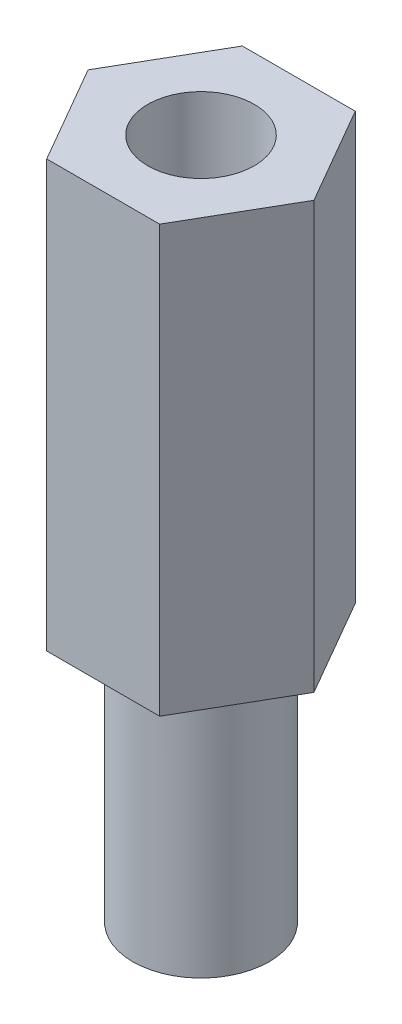
ISO-10303-21;
HEADER;
FILE_DESCRIPTION(('STEP AP214'),'2;1');
FILE_NAME('part.step','',(''),(''),'','','');
FILE_SCHEMA(('AUTOMOTIVE_DESIGN { 1 0 10303 214 1 1 1 1 }'));
ENDSEC;
DATA;
#1=APPLICATION_CONTEXT('core data for automotive mechanical design processes');
#2=APPLICATION_PROTOCOL_DEFINITION('international standard','automotive_design',2000,#1);
#3=PRODUCT_CONTEXT('',#1,'mechanical');
#4=PRODUCT('Part','Part','',(#3));
#5=PRODUCT_RELATED_PRODUCT_CATEGORY('part','',(#4));
#6=PRODUCT_DEFINITION_FORMATION('','',#4);
#7=PRODUCT_DEFINITION_CONTEXT('part definition',#1,'design');
#8=PRODUCT_DEFINITION('design','',#6,#7);
#9=PRODUCT_DEFINITION_SHAPE('','',#8);
#10=(LENGTH_UNIT() NAMED_UNIT(*) SI_UNIT(.MILLI.,.METRE.));
#11=(NAMED_UNIT(*) PLANE_ANGLE_UNIT() SI_UNIT($,.RADIAN.));
#12=(NAMED_UNIT(*) SI_UNIT($,.STERADIAN.) SOLID_ANGLE_UNIT());
#13=UNCERTAINTY_MEASURE_WITH_UNIT(LENGTH_MEASURE(1.E-05),#10,'distance_accuracy_value','');
#14=(GEOMETRIC_REPRESENTATION_CONTEXT(3) GLOBAL_UNCERTAINTY_ASSIGNED_CONTEXT((#13)) GLOBAL_UNIT_ASSIGNED_CONTEXT((#10,
#11,#12)) REPRESENTATION_CONTEXT('',''));
#15=CARTESIAN_POINT('',(0.,0.,0.));
#16=DIRECTION('',(0.,0.,1.));
#17=DIRECTION('',(1.,0.,0.));
#18=AXIS2_PLACEMENT_3D('',#15,#16,#17);
#19=CARTESIAN_POINT('',(-1.325,10.,2.29496732002876));
#20=DIRECTION('',(0.,0.,-1.));
#21=DIRECTION('',(-1.,0.,0.));
#22=AXIS2_PLACEMENT_3D('',#19,#20,#21);
#23=PLANE('',#22);
#24=DIRECTION('',(1.,0.,0.));
#25=VECTOR('',#24,1.);
#26=CARTESIAN_POINT('',(-1.325,0.,2.29496732002876));
#27=LINE('',#26,#25);
#28=CARTESIAN_POINT('',(-1.325,0.,2.29496732002876));
#29=VERTEX_POINT('',#28);
#30=CARTESIAN_POINT('',(1.325,0.,2.29496732002876));
#31=VERTEX_POINT('',#30);
#32=EDGE_CURVE('E121',#29,#31,#27,.T.);
#33=ORIENTED_EDGE('',*,*,#32,.T.);
#34=DIRECTION('',(0.,-1.,0.));
#35=VECTOR('',#34,1.);
#36=CARTESIAN_POINT('',(1.325,10.,2.29496732002876));
#37=LINE('',#36,#35);
#38=CARTESIAN_POINT('',(1.325,10.,2.29496732002876));
#39=VERTEX_POINT('',#38);
#40=EDGE_CURVE('E44',#39,#31,#37,.T.);
#41=ORIENTED_EDGE('',*,*,#40,.F.);
#42=DIRECTION('',(1.,0.,0.));
#43=VECTOR('',#42,1.);
#44=CARTESIAN_POINT('',(-1.325,10.,2.29496732002876));
#45=LINE('',#44,#43);
#46=CARTESIAN_POINT('',(-1.325,10.,2.29496732002876));
#47=VERTEX_POINT('',#46);
#48=EDGE_CURVE('E132',#47,#39,#45,.T.);
#49=ORIENTED_EDGE('',*,*,#48,.F.);
#50=DIRECTION('',(0.,-1.,0.));
#51=VECTOR('',#50,1.);
#52=CARTESIAN_POINT('',(-1.325,10.,2.29496732002876));
#53=LINE('',#52,#51);
#54=EDGE_CURVE('E117',#47,#29,#53,.T.);
#55=ORIENTED_EDGE('',*,*,#54,.T.);
#56=EDGE_LOOP('',(#33,#41,#49,#55));
#57=FACE_BOUND('',#56,.T.);
#58=ADVANCED_FACE('F36',(#57),#23,.F.);
#59=CARTESIAN_POINT('',(1.325,10.,2.29496732002876));
#60=DIRECTION('',(-0.866025403784439,0.,-0.5));
#61=DIRECTION('',(-0.5,0.,0.866025403784439));
#62=AXIS2_PLACEMENT_3D('',#59,#60,#61);
#63=PLANE('',#62);
#64=DIRECTION('',(0.5,0.,-0.866025403784439));
#65=VECTOR('',#64,1.);
#66=CARTESIAN_POINT('',(1.325,0.,2.29496732002876));
#67=LINE('',#66,#65);
#68=CARTESIAN_POINT('',(2.65,0.,0.));
#69=VERTEX_POINT('',#68);
#70=EDGE_CURVE('E124',#31,#69,#67,.T.);
#71=ORIENTED_EDGE('',*,*,#70,.T.);
#72=DIRECTION('',(0.,-1.,0.));
#73=VECTOR('',#72,1.);
#74=CARTESIAN_POINT('',(2.65,10.,0.));
#75=LINE('',#74,#73);
#76=CARTESIAN_POINT('',(2.65,10.,0.));
#77=VERTEX_POINT('',#76);
#78=EDGE_CURVE('E136',#77,#69,#75,.T.);
#79=ORIENTED_EDGE('',*,*,#78,.F.);
#80=DIRECTION('',(0.5,0.,-0.866025403784439));
#81=VECTOR('',#80,1.);
#82=CARTESIAN_POINT('',(1.325,10.,2.29496732002876));
#83=LINE('',#82,#81);
#84=EDGE_CURVE('E90',#39,#77,#83,.T.);
#85=ORIENTED_EDGE('',*,*,#84,.F.);
#86=ORIENTED_EDGE('',*,*,#40,.T.);
#87=EDGE_LOOP('',(#71,#79,#85,#86));
#88=FACE_BOUND('',#87,.T.);
#89=ADVANCED_FACE('F139',(#88),#63,.F.);
#90=CARTESIAN_POINT('',(2.65,10.,0.));
#91=DIRECTION('',(-0.866025403784438,0.,0.5));
#92=DIRECTION('',(0.5,0.,0.866025403784439));
#93=AXIS2_PLACEMENT_3D('',#90,#91,#92);
#94=PLANE('',#93);
#95=DIRECTION('',(-0.5,0.,-0.866025403784439));
#96=VECTOR('',#95,1.);
#97=CARTESIAN_POINT('',(2.65,0.,0.));
#98=LINE('',#97,#96);
#99=CARTESIAN_POINT('',(1.325,0.,-2.29496732002876));
#100=VERTEX_POINT('',#99);
#101=EDGE_CURVE('E127',#69,#100,#98,.T.);
#102=ORIENTED_EDGE('',*,*,#101,.T.);
#103=DIRECTION('',(0.,-1.,0.));
#104=VECTOR('',#103,1.);
#105=CARTESIAN_POINT('',(1.325,10.,-2.29496732002876));
#106=LINE('',#105,#104);
#107=CARTESIAN_POINT('',(1.325,10.,-2.29496732002876));
#108=VERTEX_POINT('',#107);
#109=EDGE_CURVE('E112',#108,#100,#106,.T.);
#110=ORIENTED_EDGE('',*,*,#109,.F.);
#111=DIRECTION('',(-0.5,0.,-0.866025403784439));
#112=VECTOR('',#111,1.);
#113=CARTESIAN_POINT('',(2.65,10.,0.));
#114=LINE('',#113,#112);
#115=EDGE_CURVE('E103',#77,#108,#114,.T.);
#116=ORIENTED_EDGE('',*,*,#115,.F.);
#117=ORIENTED_EDGE('',*,*,#78,.T.);
#118=EDGE_LOOP('',(#102,#110,#116,#117));
#119=FACE_BOUND('',#118,.T.);
#120=ADVANCED_FACE('F147',(#119),#94,.F.);
#121=CARTESIAN_POINT('',(1.325,10.,-2.29496732002876));
#122=DIRECTION('',(0.,0.,1.));
#123=DIRECTION('',(1.,0.,0.));
#124=AXIS2_PLACEMENT_3D('',#121,#122,#123);
#125=PLANE('',#124);
#126=DIRECTION('',(-1.,0.,0.));
#127=VECTOR('',#126,1.);
#128=CARTESIAN_POINT('',(1.325,0.,-2.29496732002876));
#129=LINE('',#128,#127);
#130=CARTESIAN_POINT('',(-1.325,0.,-2.29496732002876));
#131=VERTEX_POINT('',#130);
#132=EDGE_CURVE('E111',#100,#131,#129,.T.);
#133=ORIENTED_EDGE('',*,*,#132,.T.);
#134=DIRECTION('',(0.,-1.,0.));
#135=VECTOR('',#134,1.);
#136=CARTESIAN_POINT('',(-1.325,10.,-2.29496732002876));
#137=LINE('',#136,#135);
#138=CARTESIAN_POINT('',(-1.325,10.,-2.29496732002876));
#139=VERTEX_POINT('',#138);
#140=EDGE_CURVE('E108',#139,#131,#137,.T.);
#141=ORIENTED_EDGE('',*,*,#140,.F.);
#142=DIRECTION('',(-1.,0.,0.));
#143=VECTOR('',#142,1.);
#144=CARTESIAN_POINT('',(1.325,10.,-2.29496732002876));
#145=LINE('',#144,#143);
#146=EDGE_CURVE('E97',#108,#139,#145,.T.);
#147=ORIENTED_EDGE('',*,*,#146,.F.);
#148=ORIENTED_EDGE('',*,*,#109,.T.);
#149=EDGE_LOOP('',(#133,#141,#147,#148));
#150=FACE_BOUND('',#149,.T.);
#151=ADVANCED_FACE('F109',(#150),#125,.F.);
#152=CARTESIAN_POINT('',(-1.325,10.,-2.29496732002876));
#153=DIRECTION('',(0.866025403784439,0.,0.5));
#154=DIRECTION('',(0.5,0.,-0.866025403784439));
#155=AXIS2_PLACEMENT_3D('',#152,#153,#154);
#156=PLANE('',#155);
#157=DIRECTION('',(-0.5,0.,0.866025403784439));
#158=VECTOR('',#157,1.);
#159=CARTESIAN_POINT('',(-1.325,0.,-2.29496732002876));
#160=LINE('',#159,#158);
#161=CARTESIAN_POINT('',(-2.65,0.,0.));
#162=VERTEX_POINT('',#161);
#163=EDGE_CURVE('E75',#131,#162,#160,.T.);
#164=ORIENTED_EDGE('',*,*,#163,.T.);
#165=DIRECTION('',(0.,-1.,0.));
#166=VECTOR('',#165,1.);
#167=CARTESIAN_POINT('',(-2.65,10.,0.));
#168=LINE('',#167,#166);
#169=CARTESIAN_POINT('',(-2.65,10.,0.));
#170=VERTEX_POINT('',#169);
#171=EDGE_CURVE('E113',#170,#162,#168,.T.);
#172=ORIENTED_EDGE('',*,*,#171,.F.);
#173=DIRECTION('',(-0.5,0.,0.866025403784439));
#174=VECTOR('',#173,1.);
#175=CARTESIAN_POINT('',(-1.325,10.,-2.29496732002876));
#176=LINE('',#175,#174);
#177=EDGE_CURVE('E101',#139,#170,#176,.T.);
#178=ORIENTED_EDGE('',*,*,#177,.F.);
#179=ORIENTED_EDGE('',*,*,#140,.T.);
#180=EDGE_LOOP('',(#164,#172,#178,#179));
#181=FACE_BOUND('',#180,.T.);
#182=ADVANCED_FACE('F115',(#181),#156,.F.);
#183=CARTESIAN_POINT('',(-2.65,10.,0.));
#184=DIRECTION('',(0.866025403784438,0.,-0.5));
#185=DIRECTION('',(-0.5,0.,-0.866025403784439));
#186=AXIS2_PLACEMENT_3D('',#183,#184,#185);
#187=PLANE('',#186);
#188=DIRECTION('',(0.5,0.,0.866025403784439));
#189=VECTOR('',#188,1.);
#190=CARTESIAN_POINT('',(-2.65,0.,0.));
#191=LINE('',#190,#189);
#192=EDGE_CURVE('E81',#162,#29,#191,.T.);
#193=ORIENTED_EDGE('',*,*,#192,.T.);
#194=ORIENTED_EDGE('',*,*,#54,.F.);
#195=DIRECTION('',(0.5,0.,0.866025403784439));
#196=VECTOR('',#195,1.);
#197=CARTESIAN_POINT('',(-2.65,10.,0.));
#198=LINE('',#197,#196);
#199=EDGE_CURVE('E52',#170,#47,#198,.T.);
#200=ORIENTED_EDGE('',*,*,#199,.F.);
#201=ORIENTED_EDGE('',*,*,#171,.T.);
#202=EDGE_LOOP('',(#193,#194,#200,#201));
#203=FACE_BOUND('',#202,.T.);
#204=ADVANCED_FACE('F170',(#203),#187,.F.);
#205=CARTESIAN_POINT('',(0.,10.,0.));
#206=DIRECTION('',(0.,1.,0.));
#207=DIRECTION('',(0.,0.,1.));
#208=AXIS2_PLACEMENT_3D('',#205,#206,#207);
#209=PLANE('',#208);
#210=CARTESIAN_POINT('',(0.,10.,0.));
#211=DIRECTION('',(0.,1.,0.));
#212=DIRECTION('',(0.,0.,1.));
#213=AXIS2_PLACEMENT_3D('',#210,#211,#212);
#214=CIRCLE('',#213,1.25);
#215=CARTESIAN_POINT('',(0.,10.,1.25));
#216=VERTEX_POINT('',#215);
#217=EDGE_CURVE('E154',#216,#216,#214,.T.);
#218=ORIENTED_EDGE('',*,*,#217,.F.);
#219=EDGE_LOOP('',(#218));
#220=FACE_BOUND('',#219,.T.);
#221=ORIENTED_EDGE('',*,*,#48,.T.);
#222=ORIENTED_EDGE('',*,*,#84,.T.);
#223=ORIENTED_EDGE('',*,*,#115,.T.);
#224=ORIENTED_EDGE('',*,*,#146,.T.);
#225=ORIENTED_EDGE('',*,*,#177,.T.);
#226=ORIENTED_EDGE('',*,*,#199,.T.);
#227=EDGE_LOOP('',(#221,#222,#223,#224,#225,#226));
#228=FACE_BOUND('',#227,.T.);
#229=ADVANCED_FACE('F99',(#220,#228),#209,.T.);
#230=CARTESIAN_POINT('',(0.,0.,0.));
#231=DIRECTION('',(0.,1.,0.));
#232=DIRECTION('',(0.,0.,1.));
#233=AXIS2_PLACEMENT_3D('',#230,#231,#232);
#234=PLANE('',#233);
#235=CARTESIAN_POINT('',(0.,0.,0.));
#236=DIRECTION('',(0.,1.,0.));
#237=DIRECTION('',(0.,0.,1.));
#238=AXIS2_PLACEMENT_3D('',#235,#236,#237);
#239=CIRCLE('',#238,1.6);
#240=CARTESIAN_POINT('',(0.,0.,1.6));
#241=VERTEX_POINT('',#240);
#242=EDGE_CURVE('E11',#241,#241,#239,.F.);
#243=ORIENTED_EDGE('',*,*,#242,.F.);
#244=EDGE_LOOP('',(#243));
#245=FACE_BOUND('',#244,.T.);
#246=ORIENTED_EDGE('',*,*,#32,.F.);
#247=ORIENTED_EDGE('',*,*,#192,.F.);
#248=ORIENTED_EDGE('',*,*,#163,.F.);
#249=ORIENTED_EDGE('',*,*,#132,.F.);
#250=ORIENTED_EDGE('',*,*,#101,.F.);
#251=ORIENTED_EDGE('',*,*,#70,.F.);
#252=EDGE_LOOP('',(#246,#247,#248,#249,#250,#251));
#253=FACE_BOUND('',#252,.T.);
#254=ADVANCED_FACE('F144',(#245,#253),#234,.F.);
#255=CARTESIAN_POINT('',(0.,-6.,0.));
#256=DIRECTION('',(0.,1.,0.));
#257=DIRECTION('',(0.,0.,1.));
#258=AXIS2_PLACEMENT_3D('',#255,#256,#257);
#259=CYLINDRICAL_SURFACE('',#258,1.6);
#260=CARTESIAN_POINT('',(0.,-6.,0.));
#261=DIRECTION('',(0.,-1.,0.));
#262=DIRECTION('',(0.,0.,-1.));
#263=AXIS2_PLACEMENT_3D('',#260,#261,#262);
#264=CIRCLE('',#263,1.6);
#265=CARTESIAN_POINT('',(0.,-6.,-1.6));
#266=VERTEX_POINT('',#265);
#267=EDGE_CURVE('E125',#266,#266,#264,.T.);
#268=ORIENTED_EDGE('',*,*,#267,.F.);
#269=EDGE_LOOP('',(#268));
#270=FACE_BOUND('',#269,.T.);
#271=ORIENTED_EDGE('',*,*,#242,.T.);
#272=EDGE_LOOP('',(#271));
#273=FACE_BOUND('',#272,.T.);
#274=ADVANCED_FACE('F176',(#270,#273),#259,.T.);
#275=CARTESIAN_POINT('',(0.,-6.,0.));
#276=DIRECTION('',(0.,-1.,0.));
#277=DIRECTION('',(0.,0.,-1.));
#278=AXIS2_PLACEMENT_3D('',#275,#276,#277);
#279=PLANE('',#278);
#280=ORIENTED_EDGE('',*,*,#267,.T.);
#281=EDGE_LOOP('',(#280));
#282=FACE_BOUND('',#281,.T.);
#283=ADVANCED_FACE('F165',(#282),#279,.T.);
#284=CARTESIAN_POINT('',(0.,5.,0.));
#285=DIRECTION('',(0.,1.,0.));
#286=DIRECTION('',(0.,0.,1.));
#287=AXIS2_PLACEMENT_3D('',#284,#285,#286);
#288=CYLINDRICAL_SURFACE('',#287,1.25);
#289=CARTESIAN_POINT('',(0.,5.,0.));
#290=DIRECTION('',(0.,1.,0.));
#291=DIRECTION('',(0.,0.,1.));
#292=AXIS2_PLACEMENT_3D('',#289,#290,#291);
#293=CIRCLE('',#292,1.25);
#294=CARTESIAN_POINT('',(0.,5.,1.25));
#295=VERTEX_POINT('',#294);
#296=EDGE_CURVE('E153',#295,#295,#293,.T.);
#297=ORIENTED_EDGE('',*,*,#296,.F.);
#298=EDGE_LOOP('',(#297));
#299=FACE_BOUND('',#298,.T.);
#300=ORIENTED_EDGE('',*,*,#217,.T.);
#301=EDGE_LOOP('',(#300));
#302=FACE_BOUND('',#301,.T.);
#303=ADVANCED_FACE('F162',(#299,#302),#288,.F.);
#304=CARTESIAN_POINT('',(0.,5.,0.));
#305=DIRECTION('',(0.,1.,0.));
#306=DIRECTION('',(0.,0.,1.));
#307=AXIS2_PLACEMENT_3D('',#304,#305,#306);
#308=PLANE('',#307);
#309=ORIENTED_EDGE('',*,*,#296,.T.);
#310=EDGE_LOOP('',(#309));
#311=FACE_BOUND('',#310,.T.);
#312=ADVANCED_FACE('F160',(#311),#308,.T.);
#313=CLOSED_SHELL('',(#58,#89,#120,#151,#182,#204,#229,#254,#274,#283,#303,#312));
#314=MANIFOLD_SOLID_BREP('B2',#313);
#315=ADVANCED_BREP_SHAPE_REPRESENTATION('',(#18,#314),#14);
#316=SHAPE_DEFINITION_REPRESENTATION(#9,#315);
ENDSEC;
END-ISO-10303-21;
